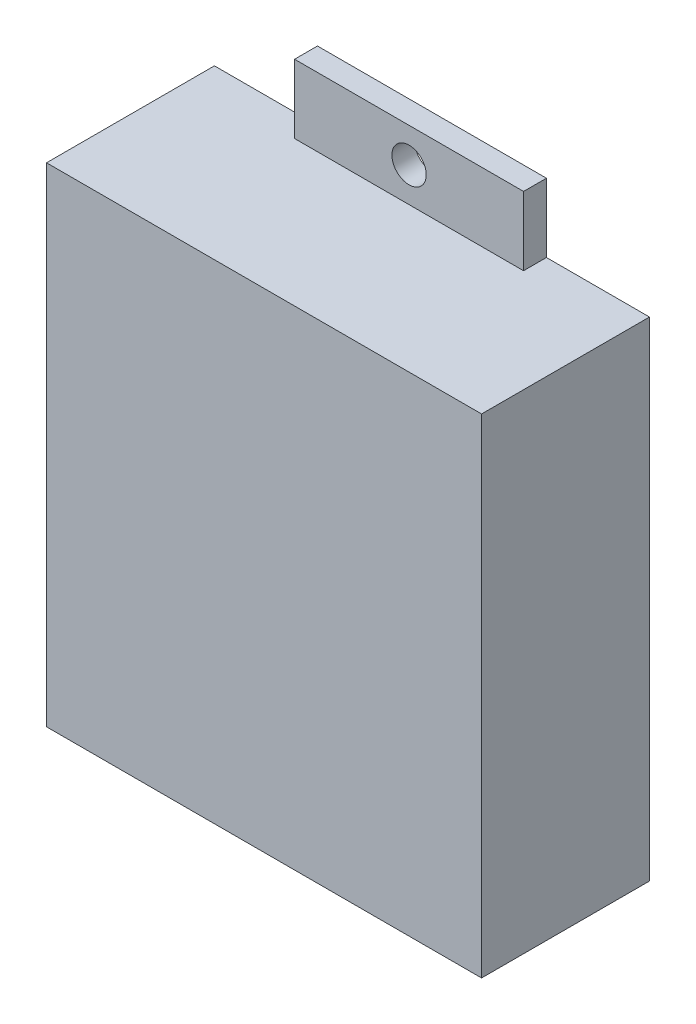
ISO-10303-21;
HEADER;
FILE_DESCRIPTION(('STEP AP214'),'2;1');
FILE_NAME('part.step','',(''),(''),'','','');
FILE_SCHEMA(('AUTOMOTIVE_DESIGN { 1 0 10303 214 1 1 1 1 }'));
ENDSEC;
DATA;
#1=APPLICATION_CONTEXT('core data for automotive mechanical design processes');
#2=APPLICATION_PROTOCOL_DEFINITION('international standard','automotive_design',2000,#1);
#3=PRODUCT_CONTEXT('',#1,'mechanical');
#4=PRODUCT('Part','Part','',(#3));
#5=PRODUCT_RELATED_PRODUCT_CATEGORY('part','',(#4));
#6=PRODUCT_DEFINITION_FORMATION('','',#4);
#7=PRODUCT_DEFINITION_CONTEXT('part definition',#1,'design');
#8=PRODUCT_DEFINITION('design','',#6,#7);
#9=PRODUCT_DEFINITION_SHAPE('','',#8);
#10=(LENGTH_UNIT() NAMED_UNIT(*) SI_UNIT(.MILLI.,.METRE.));
#11=(NAMED_UNIT(*) PLANE_ANGLE_UNIT() SI_UNIT($,.RADIAN.));
#12=(NAMED_UNIT(*) SI_UNIT($,.STERADIAN.) SOLID_ANGLE_UNIT());
#13=UNCERTAINTY_MEASURE_WITH_UNIT(LENGTH_MEASURE(1.E-05),#10,'distance_accuracy_value','');
#14=(GEOMETRIC_REPRESENTATION_CONTEXT(3) GLOBAL_UNCERTAINTY_ASSIGNED_CONTEXT((#13)) GLOBAL_UNIT_ASSIGNED_CONTEXT((#10,
#11,#12)) REPRESENTATION_CONTEXT('',''));
#15=CARTESIAN_POINT('',(0.,0.,0.));
#16=DIRECTION('',(0.,0.,1.));
#17=DIRECTION('',(1.,0.,0.));
#18=AXIS2_PLACEMENT_3D('',#15,#16,#17);
#19=CARTESIAN_POINT('',(22.,220.5,107.3));
#20=DIRECTION('',(0.,0.,1.));
#21=DIRECTION('',(0.,1.,0.));
#22=AXIS2_PLACEMENT_3D('',#19,#20,#21);
#23=CYLINDRICAL_SURFACE('',#22,2.25);
#24=DIRECTION('',(0.,0.,1.));
#25=VECTOR('',#24,1.);
#26=CARTESIAN_POINT('',(22.,222.75,107.3));
#27=LINE('',#26,#25);
#28=CARTESIAN_POINT('',(22.,222.75,107.5));
#29=VERTEX_POINT('',#28);
#30=CARTESIAN_POINT('',(22.,222.75,110.5));
#31=VERTEX_POINT('',#30);
#32=EDGE_CURVE('E10',#29,#31,#27,.T.);
#33=ORIENTED_EDGE('',*,*,#32,.F.);
#34=CARTESIAN_POINT('',(22.,220.5,107.5));
#35=DIRECTION('',(0.,0.,1.));
#36=DIRECTION('',(0.,1.,0.));
#37=AXIS2_PLACEMENT_3D('',#34,#35,#36);
#38=CIRCLE('',#37,2.25);
#39=EDGE_CURVE('E218',#29,#29,#38,.T.);
#40=ORIENTED_EDGE('',*,*,#39,.F.);
#41=ORIENTED_EDGE('',*,*,#32,.T.);
#42=CARTESIAN_POINT('',(22.,220.5,110.5));
#43=DIRECTION('',(0.,0.,1.));
#44=DIRECTION('',(0.,1.,0.));
#45=AXIS2_PLACEMENT_3D('',#42,#43,#44);
#46=CIRCLE('',#45,2.25);
#47=EDGE_CURVE('E196',#31,#31,#46,.T.);
#48=ORIENTED_EDGE('',*,*,#47,.T.);
#49=EDGE_LOOP('',(#33,#40,#41,#48));
#50=FACE_BOUND('',#49,.T.);
#51=ADVANCED_FACE('F15',(#50),#23,.F.);
#52=CARTESIAN_POINT('',(37.,225.,107.5));
#53=DIRECTION('',(0.,1.,0.));
#54=DIRECTION('',(1.,0.,0.));
#55=AXIS2_PLACEMENT_3D('',#52,#53,#54);
#56=PLANE('',#55);
#57=DIRECTION('',(0.,0.,1.));
#58=VECTOR('',#57,1.);
#59=CARTESIAN_POINT('',(37.,225.,107.5));
#60=LINE('',#59,#58);
#61=CARTESIAN_POINT('',(37.,225.,107.5));
#62=VERTEX_POINT('',#61);
#63=CARTESIAN_POINT('',(37.,225.,110.5));
#64=VERTEX_POINT('',#63);
#65=EDGE_CURVE('E25',#62,#64,#60,.T.);
#66=ORIENTED_EDGE('',*,*,#65,.F.);
#67=DIRECTION('',(-1.,0.,0.));
#68=VECTOR('',#67,1.);
#69=CARTESIAN_POINT('',(37.,225.,107.5));
#70=LINE('',#69,#68);
#71=CARTESIAN_POINT('',(7.,225.,107.5));
#72=VERTEX_POINT('',#71);
#73=EDGE_CURVE('E237',#62,#72,#70,.T.);
#74=ORIENTED_EDGE('',*,*,#73,.T.);
#75=DIRECTION('',(0.,0.,1.));
#76=VECTOR('',#75,1.);
#77=CARTESIAN_POINT('',(7.,225.,107.5));
#78=LINE('',#77,#76);
#79=CARTESIAN_POINT('',(7.,225.,110.5));
#80=VERTEX_POINT('',#79);
#81=EDGE_CURVE('E230',#72,#80,#78,.T.);
#82=ORIENTED_EDGE('',*,*,#81,.T.);
#83=DIRECTION('',(-1.,0.,0.));
#84=VECTOR('',#83,1.);
#85=CARTESIAN_POINT('',(37.,225.,110.5));
#86=LINE('',#85,#84);
#87=EDGE_CURVE('E145',#64,#80,#86,.T.);
#88=ORIENTED_EDGE('',*,*,#87,.F.);
#89=EDGE_LOOP('',(#66,#74,#82,#88));
#90=FACE_BOUND('',#89,.T.);
#91=ADVANCED_FACE('F257',(#90),#56,.T.);
#92=CARTESIAN_POINT('',(37.,216.,107.5));
#93=DIRECTION('',(-1.,0.,0.));
#94=DIRECTION('',(0.,0.,1.));
#95=AXIS2_PLACEMENT_3D('',#92,#93,#94);
#96=PLANE('',#95);
#97=ORIENTED_EDGE('',*,*,#65,.T.);
#98=DIRECTION('',(0.,1.,0.));
#99=VECTOR('',#98,1.);
#100=CARTESIAN_POINT('',(37.,216.,110.5));
#101=LINE('',#100,#99);
#102=CARTESIAN_POINT('',(37.,216.,110.5));
#103=VERTEX_POINT('',#102);
#104=EDGE_CURVE('E197',#103,#64,#101,.T.);
#105=ORIENTED_EDGE('',*,*,#104,.F.);
#106=DIRECTION('',(0.,0.,1.));
#107=VECTOR('',#106,1.);
#108=CARTESIAN_POINT('',(37.,216.,107.5));
#109=LINE('',#108,#107);
#110=CARTESIAN_POINT('',(37.,216.,107.5));
#111=VERTEX_POINT('',#110);
#112=EDGE_CURVE('E174',#111,#103,#109,.T.);
#113=ORIENTED_EDGE('',*,*,#112,.F.);
#114=DIRECTION('',(0.,1.,0.));
#115=VECTOR('',#114,1.);
#116=CARTESIAN_POINT('',(37.,216.,107.5));
#117=LINE('',#116,#115);
#118=EDGE_CURVE('E251',#111,#62,#117,.T.);
#119=ORIENTED_EDGE('',*,*,#118,.T.);
#120=EDGE_LOOP('',(#97,#105,#113,#119));
#121=FACE_BOUND('',#120,.T.);
#122=ADVANCED_FACE('F248',(#121),#96,.F.);
#123=CARTESIAN_POINT('',(37.,216.,110.5));
#124=DIRECTION('',(0.,0.,1.));
#125=DIRECTION('',(1.,0.,0.));
#126=AXIS2_PLACEMENT_3D('',#123,#124,#125);
#127=PLANE('',#126);
#128=ORIENTED_EDGE('',*,*,#47,.F.);
#129=EDGE_LOOP('',(#128));
#130=FACE_BOUND('',#129,.T.);
#131=DIRECTION('',(-1.,0.,0.));
#132=VECTOR('',#131,1.);
#133=CARTESIAN_POINT('',(37.,216.,110.5));
#134=LINE('',#133,#132);
#135=CARTESIAN_POINT('',(7.,216.,110.5));
#136=VERTEX_POINT('',#135);
#137=EDGE_CURVE('E241',#103,#136,#134,.T.);
#138=ORIENTED_EDGE('',*,*,#137,.F.);
#139=ORIENTED_EDGE('',*,*,#104,.T.);
#140=ORIENTED_EDGE('',*,*,#87,.T.);
#141=DIRECTION('',(0.,1.,0.));
#142=VECTOR('',#141,1.);
#143=CARTESIAN_POINT('',(7.,216.,110.5));
#144=LINE('',#143,#142);
#145=EDGE_CURVE('E136',#136,#80,#144,.T.);
#146=ORIENTED_EDGE('',*,*,#145,.F.);
#147=EDGE_LOOP('',(#138,#139,#140,#146));
#148=FACE_BOUND('',#147,.T.);
#149=ADVANCED_FACE('F244',(#130,#148),#127,.T.);
#150=CARTESIAN_POINT('',(7.,216.,107.5));
#151=DIRECTION('',(-1.,0.,0.));
#152=DIRECTION('',(0.,0.,1.));
#153=AXIS2_PLACEMENT_3D('',#150,#151,#152);
#154=PLANE('',#153);
#155=DIRECTION('',(0.,1.,0.));
#156=VECTOR('',#155,1.);
#157=CARTESIAN_POINT('',(7.,216.,107.5));
#158=LINE('',#157,#156);
#159=CARTESIAN_POINT('',(7.,216.,107.5));
#160=VERTEX_POINT('',#159);
#161=EDGE_CURVE('E233',#160,#72,#158,.T.);
#162=ORIENTED_EDGE('',*,*,#161,.F.);
#163=DIRECTION('',(0.,0.,1.));
#164=VECTOR('',#163,1.);
#165=CARTESIAN_POINT('',(7.,216.,107.5));
#166=LINE('',#165,#164);
#167=EDGE_CURVE('E238',#160,#136,#166,.T.);
#168=ORIENTED_EDGE('',*,*,#167,.T.);
#169=ORIENTED_EDGE('',*,*,#145,.T.);
#170=ORIENTED_EDGE('',*,*,#81,.F.);
#171=EDGE_LOOP('',(#162,#168,#169,#170));
#172=FACE_BOUND('',#171,.T.);
#173=ADVANCED_FACE('F260',(#172),#154,.T.);
#174=CARTESIAN_POINT('',(22.,147.5,107.3));
#175=DIRECTION('',(0.,0.,1.));
#176=DIRECTION('',(0.,1.,0.));
#177=AXIS2_PLACEMENT_3D('',#174,#175,#176);
#178=CYLINDRICAL_SURFACE('',#177,2.25);
#179=DIRECTION('',(0.,0.,1.));
#180=VECTOR('',#179,1.);
#181=CARTESIAN_POINT('',(22.,149.75,107.3));
#182=LINE('',#181,#180);
#183=CARTESIAN_POINT('',(22.,149.75,107.5));
#184=VERTEX_POINT('',#183);
#185=CARTESIAN_POINT('',(22.,149.75,110.5));
#186=VERTEX_POINT('',#185);
#187=EDGE_CURVE('E18',#184,#186,#182,.T.);
#188=ORIENTED_EDGE('',*,*,#187,.F.);
#189=CARTESIAN_POINT('',(22.,147.5,107.5));
#190=DIRECTION('',(0.,0.,1.));
#191=DIRECTION('',(0.,1.,0.));
#192=AXIS2_PLACEMENT_3D('',#189,#190,#191);
#193=CIRCLE('',#192,2.25);
#194=EDGE_CURVE('E275',#184,#184,#193,.T.);
#195=ORIENTED_EDGE('',*,*,#194,.F.);
#196=ORIENTED_EDGE('',*,*,#187,.T.);
#197=CARTESIAN_POINT('',(22.,147.5,110.5));
#198=DIRECTION('',(0.,0.,1.));
#199=DIRECTION('',(0.,1.,0.));
#200=AXIS2_PLACEMENT_3D('',#197,#198,#199);
#201=CIRCLE('',#200,2.25);
#202=EDGE_CURVE('E225',#186,#186,#201,.T.);
#203=ORIENTED_EDGE('',*,*,#202,.T.);
#204=EDGE_LOOP('',(#188,#195,#196,#203));
#205=FACE_BOUND('',#204,.T.);
#206=ADVANCED_FACE('F372',(#205),#178,.F.);
#207=CARTESIAN_POINT('',(37.,143.,107.5));
#208=DIRECTION('',(0.,1.,0.));
#209=DIRECTION('',(1.,0.,0.));
#210=AXIS2_PLACEMENT_3D('',#207,#208,#209);
#211=PLANE('',#210);
#212=DIRECTION('',(-1.,0.,0.));
#213=VECTOR('',#212,1.);
#214=CARTESIAN_POINT('',(37.,143.,110.5));
#215=LINE('',#214,#213);
#216=CARTESIAN_POINT('',(37.,143.,110.5));
#217=VERTEX_POINT('',#216);
#218=CARTESIAN_POINT('',(7.,143.,110.5));
#219=VERTEX_POINT('',#218);
#220=EDGE_CURVE('E224',#217,#219,#215,.T.);
#221=ORIENTED_EDGE('',*,*,#220,.T.);
#222=DIRECTION('',(0.,0.,1.));
#223=VECTOR('',#222,1.);
#224=CARTESIAN_POINT('',(7.,143.,107.5));
#225=LINE('',#224,#223);
#226=CARTESIAN_POINT('',(7.,143.,107.5));
#227=VERTEX_POINT('',#226);
#228=EDGE_CURVE('E213',#227,#219,#225,.T.);
#229=ORIENTED_EDGE('',*,*,#228,.F.);
#230=DIRECTION('',(-1.,0.,0.));
#231=VECTOR('',#230,1.);
#232=CARTESIAN_POINT('',(37.,143.,107.5));
#233=LINE('',#232,#231);
#234=CARTESIAN_POINT('',(37.,143.,107.5));
#235=VERTEX_POINT('',#234);
#236=EDGE_CURVE('E268',#235,#227,#233,.T.);
#237=ORIENTED_EDGE('',*,*,#236,.F.);
#238=DIRECTION('',(0.,0.,1.));
#239=VECTOR('',#238,1.);
#240=CARTESIAN_POINT('',(37.,143.,107.5));
#241=LINE('',#240,#239);
#242=EDGE_CURVE('E175',#235,#217,#241,.T.);
#243=ORIENTED_EDGE('',*,*,#242,.T.);
#244=EDGE_LOOP('',(#221,#229,#237,#243));
#245=FACE_BOUND('',#244,.T.);
#246=ADVANCED_FACE('F344',(#245),#211,.F.);
#247=CARTESIAN_POINT('',(50.5,216.,107.5));
#248=DIRECTION('',(0.,1.,0.));
#249=DIRECTION('',(1.,0.,0.));
#250=AXIS2_PLACEMENT_3D('',#247,#248,#249);
#251=PLANE('',#250);
#252=DIRECTION('',(-1.,0.,0.));
#253=VECTOR('',#252,1.);
#254=CARTESIAN_POINT('',(50.5,216.,129.5));
#255=LINE('',#254,#253);
#256=CARTESIAN_POINT('',(50.5,216.,129.5));
#257=VERTEX_POINT('',#256);
#258=CARTESIAN_POINT('',(-6.5,216.,129.5));
#259=VERTEX_POINT('',#258);
#260=EDGE_CURVE('E177',#257,#259,#255,.T.);
#261=ORIENTED_EDGE('',*,*,#260,.F.);
#262=DIRECTION('',(0.,0.,1.));
#263=VECTOR('',#262,1.);
#264=CARTESIAN_POINT('',(50.5,216.,107.5));
#265=LINE('',#264,#263);
#266=CARTESIAN_POINT('',(50.5,216.,107.5));
#267=VERTEX_POINT('',#266);
#268=EDGE_CURVE('E165',#267,#257,#265,.T.);
#269=ORIENTED_EDGE('',*,*,#268,.F.);
#270=DIRECTION('',(-1.,0.,0.));
#271=VECTOR('',#270,1.);
#272=CARTESIAN_POINT('',(50.5,216.,107.5));
#273=LINE('',#272,#271);
#274=EDGE_CURVE('E299',#267,#111,#273,.T.);
#275=ORIENTED_EDGE('',*,*,#274,.T.);
#276=ORIENTED_EDGE('',*,*,#112,.T.);
#277=ORIENTED_EDGE('',*,*,#137,.T.);
#278=ORIENTED_EDGE('',*,*,#167,.F.);
#279=DIRECTION('',(-1.,0.,0.));
#280=VECTOR('',#279,1.);
#281=CARTESIAN_POINT('',(50.5,216.,107.5));
#282=LINE('',#281,#280);
#283=CARTESIAN_POINT('',(-6.5,216.,107.5));
#284=VERTEX_POINT('',#283);
#285=EDGE_CURVE('E155',#160,#284,#282,.T.);
#286=ORIENTED_EDGE('',*,*,#285,.T.);
#287=DIRECTION('',(0.,0.,1.));
#288=VECTOR('',#287,1.);
#289=CARTESIAN_POINT('',(-6.5,216.,107.5));
#290=LINE('',#289,#288);
#291=EDGE_CURVE('E159',#284,#259,#290,.T.);
#292=ORIENTED_EDGE('',*,*,#291,.T.);
#293=EDGE_LOOP('',(#261,#269,#275,#276,#277,#278,#286,#292));
#294=FACE_BOUND('',#293,.T.);
#295=ADVANCED_FACE('F178',(#294),#251,.T.);
#296=CARTESIAN_POINT('',(50.5,152.,107.5));
#297=DIRECTION('',(-1.,0.,0.));
#298=DIRECTION('',(0.,0.,1.));
#299=AXIS2_PLACEMENT_3D('',#296,#297,#298);
#300=PLANE('',#299);
#301=ORIENTED_EDGE('',*,*,#268,.T.);
#302=DIRECTION('',(0.,1.,0.));
#303=VECTOR('',#302,1.);
#304=CARTESIAN_POINT('',(50.5,152.,129.5));
#305=LINE('',#304,#303);
#306=CARTESIAN_POINT('',(50.5,152.,129.5));
#307=VERTEX_POINT('',#306);
#308=EDGE_CURVE('E169',#307,#257,#305,.T.);
#309=ORIENTED_EDGE('',*,*,#308,.F.);
#310=DIRECTION('',(0.,0.,1.));
#311=VECTOR('',#310,1.);
#312=CARTESIAN_POINT('',(50.5,152.,107.5));
#313=LINE('',#312,#311);
#314=CARTESIAN_POINT('',(50.5,152.,107.5));
#315=VERTEX_POINT('',#314);
#316=EDGE_CURVE('E190',#315,#307,#313,.T.);
#317=ORIENTED_EDGE('',*,*,#316,.F.);
#318=DIRECTION('',(0.,1.,0.));
#319=VECTOR('',#318,1.);
#320=CARTESIAN_POINT('',(50.5,152.,107.5));
#321=LINE('',#320,#319);
#322=EDGE_CURVE('E170',#315,#267,#321,.T.);
#323=ORIENTED_EDGE('',*,*,#322,.T.);
#324=EDGE_LOOP('',(#301,#309,#317,#323));
#325=FACE_BOUND('',#324,.T.);
#326=ADVANCED_FACE('F166',(#325),#300,.F.);
#327=CARTESIAN_POINT('',(37.,143.,107.5));
#328=DIRECTION('',(-1.,0.,0.));
#329=DIRECTION('',(0.,0.,1.));
#330=AXIS2_PLACEMENT_3D('',#327,#328,#329);
#331=PLANE('',#330);
#332=DIRECTION('',(0.,0.,1.));
#333=VECTOR('',#332,1.);
#334=CARTESIAN_POINT('',(37.,152.,107.5));
#335=LINE('',#334,#333);
#336=CARTESIAN_POINT('',(37.,152.,107.5));
#337=VERTEX_POINT('',#336);
#338=CARTESIAN_POINT('',(37.,152.,110.5));
#339=VERTEX_POINT('',#338);
#340=EDGE_CURVE('E202',#337,#339,#335,.T.);
#341=ORIENTED_EDGE('',*,*,#340,.T.);
#342=DIRECTION('',(0.,1.,0.));
#343=VECTOR('',#342,1.);
#344=CARTESIAN_POINT('',(37.,143.,110.5));
#345=LINE('',#344,#343);
#346=EDGE_CURVE('E229',#217,#339,#345,.T.);
#347=ORIENTED_EDGE('',*,*,#346,.F.);
#348=ORIENTED_EDGE('',*,*,#242,.F.);
#349=DIRECTION('',(0.,1.,0.));
#350=VECTOR('',#349,1.);
#351=CARTESIAN_POINT('',(37.,143.,107.5));
#352=LINE('',#351,#350);
#353=EDGE_CURVE('E269',#235,#337,#352,.T.);
#354=ORIENTED_EDGE('',*,*,#353,.T.);
#355=EDGE_LOOP('',(#341,#347,#348,#354));
#356=FACE_BOUND('',#355,.T.);
#357=ADVANCED_FACE('F329',(#356),#331,.F.);
#358=CARTESIAN_POINT('',(37.,143.,110.5));
#359=DIRECTION('',(0.,0.,1.));
#360=DIRECTION('',(1.,0.,0.));
#361=AXIS2_PLACEMENT_3D('',#358,#359,#360);
#362=PLANE('',#361);
#363=ORIENTED_EDGE('',*,*,#202,.F.);
#364=EDGE_LOOP('',(#363));
#365=FACE_BOUND('',#364,.T.);
#366=ORIENTED_EDGE('',*,*,#220,.F.);
#367=ORIENTED_EDGE('',*,*,#346,.T.);
#368=DIRECTION('',(-1.,0.,0.));
#369=VECTOR('',#368,1.);
#370=CARTESIAN_POINT('',(37.,152.,110.5));
#371=LINE('',#370,#369);
#372=CARTESIAN_POINT('',(7.,152.,110.5));
#373=VERTEX_POINT('',#372);
#374=EDGE_CURVE('E198',#339,#373,#371,.T.);
#375=ORIENTED_EDGE('',*,*,#374,.T.);
#376=DIRECTION('',(0.,1.,0.));
#377=VECTOR('',#376,1.);
#378=CARTESIAN_POINT('',(7.,143.,110.5));
#379=LINE('',#378,#377);
#380=EDGE_CURVE('E217',#219,#373,#379,.T.);
#381=ORIENTED_EDGE('',*,*,#380,.F.);
#382=EDGE_LOOP('',(#366,#367,#375,#381));
#383=FACE_BOUND('',#382,.T.);
#384=ADVANCED_FACE('F342',(#365,#383),#362,.T.);
#385=CARTESIAN_POINT('',(7.,143.,107.5));
#386=DIRECTION('',(-1.,0.,0.));
#387=DIRECTION('',(0.,0.,1.));
#388=AXIS2_PLACEMENT_3D('',#385,#386,#387);
#389=PLANE('',#388);
#390=DIRECTION('',(0.,1.,0.));
#391=VECTOR('',#390,1.);
#392=CARTESIAN_POINT('',(7.,143.,107.5));
#393=LINE('',#392,#391);
#394=CARTESIAN_POINT('',(7.,152.,107.5));
#395=VERTEX_POINT('',#394);
#396=EDGE_CURVE('E66',#227,#395,#393,.T.);
#397=ORIENTED_EDGE('',*,*,#396,.F.);
#398=ORIENTED_EDGE('',*,*,#228,.T.);
#399=ORIENTED_EDGE('',*,*,#380,.T.);
#400=DIRECTION('',(0.,0.,1.));
#401=VECTOR('',#400,1.);
#402=CARTESIAN_POINT('',(7.,152.,107.5));
#403=LINE('',#402,#401);
#404=EDGE_CURVE('E203',#395,#373,#403,.T.);
#405=ORIENTED_EDGE('',*,*,#404,.F.);
#406=EDGE_LOOP('',(#397,#398,#399,#405));
#407=FACE_BOUND('',#406,.T.);
#408=ADVANCED_FACE('F349',(#407),#389,.T.);
#409=CARTESIAN_POINT('',(50.5,152.,107.5));
#410=DIRECTION('',(0.,0.,1.));
#411=DIRECTION('',(1.,0.,0.));
#412=AXIS2_PLACEMENT_3D('',#409,#410,#411);
#413=PLANE('',#412);
#414=ORIENTED_EDGE('',*,*,#39,.T.);
#415=EDGE_LOOP('',(#414));
#416=FACE_BOUND('',#415,.T.);
#417=ORIENTED_EDGE('',*,*,#194,.T.);
#418=EDGE_LOOP('',(#417));
#419=FACE_BOUND('',#418,.T.);
#420=ORIENTED_EDGE('',*,*,#353,.F.);
#421=ORIENTED_EDGE('',*,*,#236,.T.);
#422=ORIENTED_EDGE('',*,*,#396,.T.);
#423=DIRECTION('',(-1.,0.,0.));
#424=VECTOR('',#423,1.);
#425=CARTESIAN_POINT('',(50.5,152.,107.5));
#426=LINE('',#425,#424);
#427=CARTESIAN_POINT('',(-6.5,152.,107.5));
#428=VERTEX_POINT('',#427);
#429=EDGE_CURVE('E208',#395,#428,#426,.T.);
#430=ORIENTED_EDGE('',*,*,#429,.T.);
#431=DIRECTION('',(0.,1.,0.));
#432=VECTOR('',#431,1.);
#433=CARTESIAN_POINT('',(-6.5,152.,107.5));
#434=LINE('',#433,#432);
#435=EDGE_CURVE('E209',#428,#284,#434,.T.);
#436=ORIENTED_EDGE('',*,*,#435,.T.);
#437=ORIENTED_EDGE('',*,*,#285,.F.);
#438=ORIENTED_EDGE('',*,*,#161,.T.);
#439=ORIENTED_EDGE('',*,*,#73,.F.);
#440=ORIENTED_EDGE('',*,*,#118,.F.);
#441=ORIENTED_EDGE('',*,*,#274,.F.);
#442=ORIENTED_EDGE('',*,*,#322,.F.);
#443=DIRECTION('',(-1.,0.,0.));
#444=VECTOR('',#443,1.);
#445=CARTESIAN_POINT('',(50.5,152.,107.5));
#446=LINE('',#445,#444);
#447=EDGE_CURVE('E288',#315,#337,#446,.T.);
#448=ORIENTED_EDGE('',*,*,#447,.T.);
#449=EDGE_LOOP('',(#420,#421,#422,#430,#436,#437,#438,#439,#440,#441,#442,#448));
#450=FACE_BOUND('',#449,.T.);
#451=ADVANCED_FACE('F319',(#416,#419,#450),#413,.F.);
#452=CARTESIAN_POINT('',(-6.5,152.,107.5));
#453=DIRECTION('',(-1.,0.,0.));
#454=DIRECTION('',(0.,0.,1.));
#455=AXIS2_PLACEMENT_3D('',#452,#453,#454);
#456=PLANE('',#455);
#457=ORIENTED_EDGE('',*,*,#435,.F.);
#458=DIRECTION('',(0.,0.,1.));
#459=VECTOR('',#458,1.);
#460=CARTESIAN_POINT('',(-6.5,152.,107.5));
#461=LINE('',#460,#459);
#462=CARTESIAN_POINT('',(-6.5,152.,129.5));
#463=VERTEX_POINT('',#462);
#464=EDGE_CURVE('E204',#428,#463,#461,.T.);
#465=ORIENTED_EDGE('',*,*,#464,.T.);
#466=DIRECTION('',(0.,1.,0.));
#467=VECTOR('',#466,1.);
#468=CARTESIAN_POINT('',(-6.5,152.,129.5));
#469=LINE('',#468,#467);
#470=EDGE_CURVE('E82',#463,#259,#469,.T.);
#471=ORIENTED_EDGE('',*,*,#470,.T.);
#472=ORIENTED_EDGE('',*,*,#291,.F.);
#473=EDGE_LOOP('',(#457,#465,#471,#472));
#474=FACE_BOUND('',#473,.T.);
#475=ADVANCED_FACE('F351',(#474),#456,.T.);
#476=CARTESIAN_POINT('',(50.5,152.,129.5));
#477=DIRECTION('',(0.,0.,1.));
#478=DIRECTION('',(1.,0.,0.));
#479=AXIS2_PLACEMENT_3D('',#476,#477,#478);
#480=PLANE('',#479);
#481=DIRECTION('',(-1.,0.,0.));
#482=VECTOR('',#481,1.);
#483=CARTESIAN_POINT('',(50.5,152.,129.5));
#484=LINE('',#483,#482);
#485=EDGE_CURVE('E182',#307,#463,#484,.T.);
#486=ORIENTED_EDGE('',*,*,#485,.F.);
#487=ORIENTED_EDGE('',*,*,#308,.T.);
#488=ORIENTED_EDGE('',*,*,#260,.T.);
#489=ORIENTED_EDGE('',*,*,#470,.F.);
#490=EDGE_LOOP('',(#486,#487,#488,#489));
#491=FACE_BOUND('',#490,.T.);
#492=ADVANCED_FACE('F181',(#491),#480,.T.);
#493=CARTESIAN_POINT('',(50.5,152.,107.5));
#494=DIRECTION('',(0.,1.,0.));
#495=DIRECTION('',(1.,0.,0.));
#496=AXIS2_PLACEMENT_3D('',#493,#494,#495);
#497=PLANE('',#496);
#498=ORIENTED_EDGE('',*,*,#464,.F.);
#499=ORIENTED_EDGE('',*,*,#429,.F.);
#500=ORIENTED_EDGE('',*,*,#404,.T.);
#501=ORIENTED_EDGE('',*,*,#374,.F.);
#502=ORIENTED_EDGE('',*,*,#340,.F.);
#503=ORIENTED_EDGE('',*,*,#447,.F.);
#504=ORIENTED_EDGE('',*,*,#316,.T.);
#505=ORIENTED_EDGE('',*,*,#485,.T.);
#506=EDGE_LOOP('',(#498,#499,#500,#501,#502,#503,#504,#505));
#507=FACE_BOUND('',#506,.T.);
#508=ADVANCED_FACE('F337',(#507),#497,.F.);
#509=CLOSED_SHELL('',(#51,#91,#122,#149,#173,#206,#246,#295,#326,#357,#384,#408,#451,#475,#492,#508));
#510=MANIFOLD_SOLID_BREP('B1',#509);
#511=ADVANCED_BREP_SHAPE_REPRESENTATION('',(#18,#510),#14);
#512=SHAPE_DEFINITION_REPRESENTATION(#9,#511);
ENDSEC;
END-ISO-10303-21;
